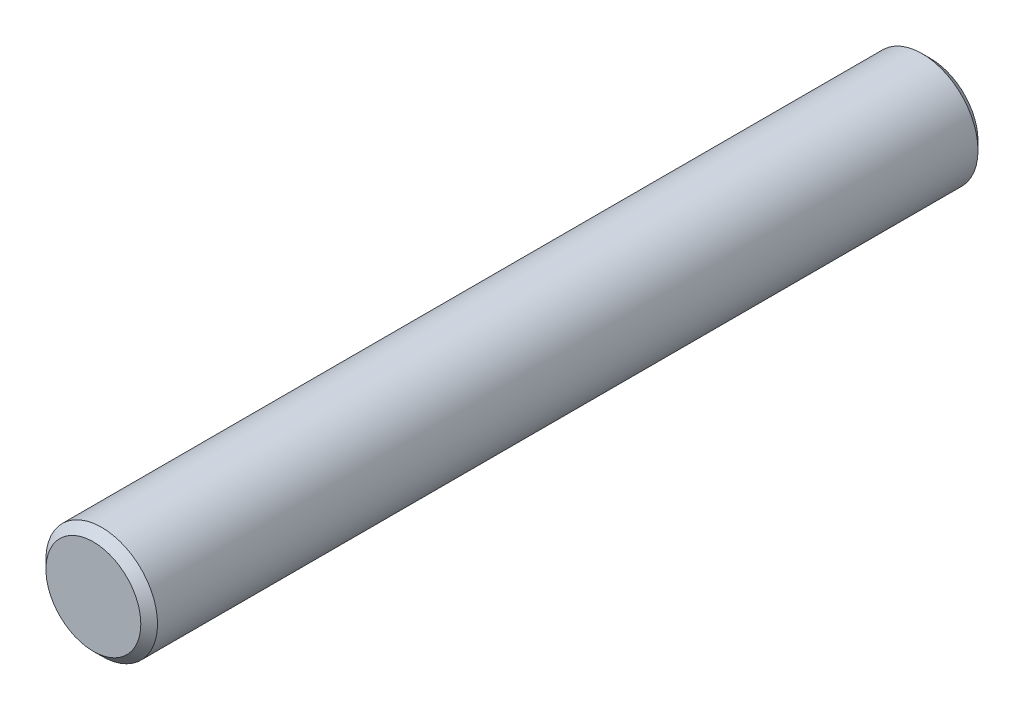
ISO-10303-21;
HEADER;
FILE_DESCRIPTION(('STEP AP214'),'2;1');
FILE_NAME('part.step','',(''),(''),'','','');
FILE_SCHEMA(('AUTOMOTIVE_DESIGN { 1 0 10303 214 1 1 1 1 }'));
ENDSEC;
DATA;
#1=APPLICATION_CONTEXT('core data for automotive mechanical design processes');
#2=APPLICATION_PROTOCOL_DEFINITION('international standard','automotive_design',2000,#1);
#3=PRODUCT_CONTEXT('',#1,'mechanical');
#4=PRODUCT('Part','Part','',(#3));
#5=PRODUCT_RELATED_PRODUCT_CATEGORY('part','',(#4));
#6=PRODUCT_DEFINITION_FORMATION('','',#4);
#7=PRODUCT_DEFINITION_CONTEXT('part definition',#1,'design');
#8=PRODUCT_DEFINITION('design','',#6,#7);
#9=PRODUCT_DEFINITION_SHAPE('','',#8);
#10=(LENGTH_UNIT() NAMED_UNIT(*) SI_UNIT(.MILLI.,.METRE.));
#11=(NAMED_UNIT(*) PLANE_ANGLE_UNIT() SI_UNIT($,.RADIAN.));
#12=(NAMED_UNIT(*) SI_UNIT($,.STERADIAN.) SOLID_ANGLE_UNIT());
#13=UNCERTAINTY_MEASURE_WITH_UNIT(LENGTH_MEASURE(1.E-05),#10,'distance_accuracy_value','');
#14=(GEOMETRIC_REPRESENTATION_CONTEXT(3) GLOBAL_UNCERTAINTY_ASSIGNED_CONTEXT((#13)) GLOBAL_UNIT_ASSIGNED_CONTEXT((#10,
#11,#12)) REPRESENTATION_CONTEXT('',''));
#15=CARTESIAN_POINT('',(0.,0.,0.));
#16=DIRECTION('',(0.,0.,1.));
#17=DIRECTION('',(1.,0.,0.));
#18=AXIS2_PLACEMENT_3D('',#15,#16,#17);
#19=CARTESIAN_POINT('',(0.,0.,30.));
#20=DIRECTION('',(0.,0.,-1.));
#21=DIRECTION('',(-1.,0.,0.));
#22=AXIS2_PLACEMENT_3D('',#19,#20,#21);
#23=CYLINDRICAL_SURFACE('',#22,4.);
#24=CARTESIAN_POINT('',(0.,0.,-29.4));
#25=DIRECTION('',(0.,0.,1.));
#26=DIRECTION('',(1.,0.,0.));
#27=AXIS2_PLACEMENT_3D('',#24,#25,#26);
#28=CIRCLE('',#27,4.);
#29=CARTESIAN_POINT('',(4.,0.,-29.4));
#30=VERTEX_POINT('',#29);
#31=EDGE_CURVE('E56',#30,#30,#28,.T.);
#32=ORIENTED_EDGE('',*,*,#31,.T.);
#33=EDGE_LOOP('',(#32));
#34=FACE_BOUND('',#33,.T.);
#35=CARTESIAN_POINT('',(0.,0.,29.4));
#36=DIRECTION('',(0.,0.,1.));
#37=DIRECTION('',(1.,0.,0.));
#38=AXIS2_PLACEMENT_3D('',#35,#36,#37);
#39=CIRCLE('',#38,4.);
#40=CARTESIAN_POINT('',(4.,0.,29.4));
#41=VERTEX_POINT('',#40);
#42=EDGE_CURVE('E61',#41,#41,#39,.F.);
#43=ORIENTED_EDGE('',*,*,#42,.T.);
#44=EDGE_LOOP('',(#43));
#45=FACE_BOUND('',#44,.T.);
#46=ADVANCED_FACE('F43',(#34,#45),#23,.T.);
#47=CARTESIAN_POINT('',(0.,0.,30.));
#48=DIRECTION('',(0.,0.,1.));
#49=DIRECTION('',(1.,0.,0.));
#50=AXIS2_PLACEMENT_3D('',#47,#48,#49);
#51=PLANE('',#50);
#52=CARTESIAN_POINT('',(0.,0.,30.));
#53=DIRECTION('',(0.,0.,1.));
#54=DIRECTION('',(1.,0.,0.));
#55=AXIS2_PLACEMENT_3D('',#52,#53,#54);
#56=CIRCLE('',#55,3.4);
#57=CARTESIAN_POINT('',(3.4,0.,30.));
#58=VERTEX_POINT('',#57);
#59=EDGE_CURVE('E10',#58,#58,#56,.T.);
#60=ORIENTED_EDGE('',*,*,#59,.T.);
#61=EDGE_LOOP('',(#60));
#62=FACE_BOUND('',#61,.T.);
#63=ADVANCED_FACE('F78',(#62),#51,.T.);
#64=CARTESIAN_POINT('',(0.,0.,-30.));
#65=DIRECTION('',(0.,0.,1.));
#66=DIRECTION('',(1.,0.,0.));
#67=AXIS2_PLACEMENT_3D('',#64,#65,#66);
#68=PLANE('',#67);
#69=CARTESIAN_POINT('',(0.,0.,-30.));
#70=DIRECTION('',(0.,0.,1.));
#71=DIRECTION('',(1.,0.,0.));
#72=AXIS2_PLACEMENT_3D('',#69,#70,#71);
#73=CIRCLE('',#72,3.39999999999999);
#74=CARTESIAN_POINT('',(3.39999999999998,0.,-30.));
#75=VERTEX_POINT('',#74);
#76=EDGE_CURVE('E51',#75,#75,#73,.F.);
#77=ORIENTED_EDGE('',*,*,#76,.T.);
#78=EDGE_LOOP('',(#77));
#79=FACE_BOUND('',#78,.T.);
#80=ADVANCED_FACE('F75',(#79),#68,.F.);
#81=CARTESIAN_POINT('',(0.,0.,-29.4));
#82=DIRECTION('',(0.,0.,1.));
#83=DIRECTION('',(1.,0.,0.));
#84=AXIS2_PLACEMENT_3D('',#81,#82,#83);
#85=CONICAL_SURFACE('',#84,4.,0.785398163397451);
#86=CARTESIAN_POINT('',(3.39999999999998,0.,-30.));
#87=CARTESIAN_POINT('',(3.40624999999998,0.,-29.99375));
#88=CARTESIAN_POINT('',(3.41249999999998,0.,-29.9875));
#89=CARTESIAN_POINT('',(3.42499999999999,0.,-29.975));
#90=CARTESIAN_POINT('',(3.43124999999999,0.,-29.96875));
#91=CARTESIAN_POINT('',(3.44374999999999,0.,-29.95625));
#92=CARTESIAN_POINT('',(3.44999999999999,0.,-29.95));
#93=CARTESIAN_POINT('',(3.46249999999999,0.,-29.9375));
#94=CARTESIAN_POINT('',(3.46874999999999,0.,-29.93125));
#95=CARTESIAN_POINT('',(3.48124999999999,0.,-29.91875));
#96=CARTESIAN_POINT('',(3.48749999999999,0.,-29.9125));
#97=CARTESIAN_POINT('',(3.49999999999999,0.,-29.9));
#98=CARTESIAN_POINT('',(3.50624999999999,0.,-29.89375));
#99=CARTESIAN_POINT('',(3.51874999999999,0.,-29.88125));
#100=CARTESIAN_POINT('',(3.52499999999999,0.,-29.875));
#101=CARTESIAN_POINT('',(3.53749999999999,0.,-29.8625));
#102=CARTESIAN_POINT('',(3.54374999999999,0.,-29.85625));
#103=CARTESIAN_POINT('',(3.55624999999999,0.,-29.84375));
#104=CARTESIAN_POINT('',(3.56249999999999,0.,-29.8375));
#105=CARTESIAN_POINT('',(3.57499999999999,0.,-29.825));
#106=CARTESIAN_POINT('',(3.58124999999999,0.,-29.81875));
#107=CARTESIAN_POINT('',(3.59374999999999,0.,-29.80625));
#108=CARTESIAN_POINT('',(3.59999999999999,0.,-29.8));
#109=CARTESIAN_POINT('',(3.61249999999999,0.,-29.7875));
#110=CARTESIAN_POINT('',(3.61874999999999,0.,-29.78125));
#111=CARTESIAN_POINT('',(3.63124999999999,0.,-29.76875));
#112=CARTESIAN_POINT('',(3.63749999999999,0.,-29.7625));
#113=CARTESIAN_POINT('',(3.64999999999999,0.,-29.75));
#114=CARTESIAN_POINT('',(3.65624999999999,0.,-29.74375));
#115=CARTESIAN_POINT('',(3.66874999999999,0.,-29.73125));
#116=CARTESIAN_POINT('',(3.67499999999999,0.,-29.725));
#117=CARTESIAN_POINT('',(3.68749999999999,0.,-29.7125));
#118=CARTESIAN_POINT('',(3.69374999999999,0.,-29.70625));
#119=CARTESIAN_POINT('',(3.70624999999999,0.,-29.69375));
#120=CARTESIAN_POINT('',(3.71249999999999,0.,-29.6875));
#121=CARTESIAN_POINT('',(3.72499999999999,0.,-29.675));
#122=CARTESIAN_POINT('',(3.73124999999999,0.,-29.66875));
#123=CARTESIAN_POINT('',(3.74374999999999,0.,-29.65625));
#124=CARTESIAN_POINT('',(3.74999999999999,0.,-29.65));
#125=CARTESIAN_POINT('',(3.76249999999999,0.,-29.6375));
#126=CARTESIAN_POINT('',(3.76874999999999,0.,-29.63125));
#127=CARTESIAN_POINT('',(3.78124999999999,0.,-29.61875));
#128=CARTESIAN_POINT('',(3.78749999999999,0.,-29.6125));
#129=CARTESIAN_POINT('',(3.79999999999999,0.,-29.6));
#130=CARTESIAN_POINT('',(3.80624999999999,0.,-29.59375));
#131=CARTESIAN_POINT('',(3.81874999999999,0.,-29.58125));
#132=CARTESIAN_POINT('',(3.82499999999999,0.,-29.575));
#133=CARTESIAN_POINT('',(3.8375,0.,-29.5625));
#134=CARTESIAN_POINT('',(3.84374999999999,0.,-29.55625));
#135=CARTESIAN_POINT('',(3.85625,0.,-29.54375));
#136=CARTESIAN_POINT('',(3.86249999999999,0.,-29.5375));
#137=CARTESIAN_POINT('',(3.875,0.,-29.525));
#138=CARTESIAN_POINT('',(3.88125,0.,-29.51875));
#139=CARTESIAN_POINT('',(3.89375,0.,-29.50625));
#140=CARTESIAN_POINT('',(3.9,0.,-29.5));
#141=CARTESIAN_POINT('',(3.9125,0.,-29.4875));
#142=CARTESIAN_POINT('',(3.91875,0.,-29.48125));
#143=CARTESIAN_POINT('',(3.93125,0.,-29.46875));
#144=CARTESIAN_POINT('',(3.9375,0.,-29.4625));
#145=CARTESIAN_POINT('',(3.95,0.,-29.45));
#146=CARTESIAN_POINT('',(3.95625,0.,-29.44375));
#147=CARTESIAN_POINT('',(3.96875,0.,-29.43125));
#148=CARTESIAN_POINT('',(3.975,0.,-29.425));
#149=CARTESIAN_POINT('',(3.9875,0.,-29.4125));
#150=CARTESIAN_POINT('',(3.99375,0.,-29.40625));
#151=CARTESIAN_POINT('',(4.,0.,-29.4));
#152=B_SPLINE_CURVE_WITH_KNOTS('',3,(#86,#87,#88,#89,#90,#91,#92,#93,#94,#95,#96,#97,#98,#99,
#100,#101,#102,#103,#104,#105,#106,#107,#108,#109,#110,#111,#112,#113,#114,#115,#116,#117,#118,
#119,#120,#121,#122,#123,#124,#125,#126,#127,#128,#129,#130,#131,#132,#133,#134,#135,#136,#137,
#138,#139,#140,#141,#142,#143,#144,#145,#146,#147,#148,#149,#150,#151),.UNSPECIFIED.,.F.,.F.,(4,
2,2,2,2,2,2,2,2,2,2,2,2,2,2,2,2,2,2,2,2,2,2,2,2,2,2,2,2,2,2,2,4),(0.,0.0265165042944969,
0.0530330085889935,0.0795495128834904,0.106066017177985,0.132582521472481,0.159099025766978,
0.185615530061473,0.21213203435597,0.238648538650467,0.265165042944961,0.291681547239458,
0.318198051533955,0.344714555828449,0.371231060122946,0.397747564417443,0.424264068711937,
0.450780573006434,0.477297077300931,0.503813581595427,0.530330085889922,0.556846590184419,
0.583363094478915,0.60987959877341,0.636396103067907,0.662912607362404,0.689429111656898,
0.715945615951394,0.742462120245892,0.768978624540386,0.795495128834882,0.822011633129379,
0.848528137423876),.UNSPECIFIED.);
#153=EDGE_CURVE('BSEAM71',#75,#30,#152,.T.);
#154=ORIENTED_EDGE('',*,*,#76,.F.);
#155=ORIENTED_EDGE('',*,*,#31,.F.);
#156=ORIENTED_EDGE('',*,*,#153,.T.);
#157=ORIENTED_EDGE('',*,*,#153,.F.);
#158=EDGE_LOOP('',(#154,#156,#155,#157));
#159=FACE_BOUND('',#158,.T.);
#160=ADVANCED_FACE('F71',(#159),#85,.T.);
#161=CARTESIAN_POINT('',(0.,0.,30.));
#162=DIRECTION('',(0.,0.,-1.));
#163=DIRECTION('',(-1.,0.,0.));
#164=AXIS2_PLACEMENT_3D('',#161,#162,#163);
#165=CONICAL_SURFACE('',#164,3.4,0.785398163397448);
#166=ORIENTED_EDGE('',*,*,#42,.F.);
#167=EDGE_LOOP('',(#166));
#168=FACE_BOUND('',#167,.T.);
#169=ORIENTED_EDGE('',*,*,#59,.F.);
#170=EDGE_LOOP('',(#169));
#171=FACE_BOUND('',#170,.T.);
#172=ADVANCED_FACE('F45',(#168,#171),#165,.T.);
#173=CLOSED_SHELL('',(#46,#63,#80,#160,#172));
#174=MANIFOLD_SOLID_BREP('B2',#173);
#175=ADVANCED_BREP_SHAPE_REPRESENTATION('',(#18,#174),#14);
#176=SHAPE_DEFINITION_REPRESENTATION(#9,#175);
ENDSEC;
END-ISO-10303-21;
